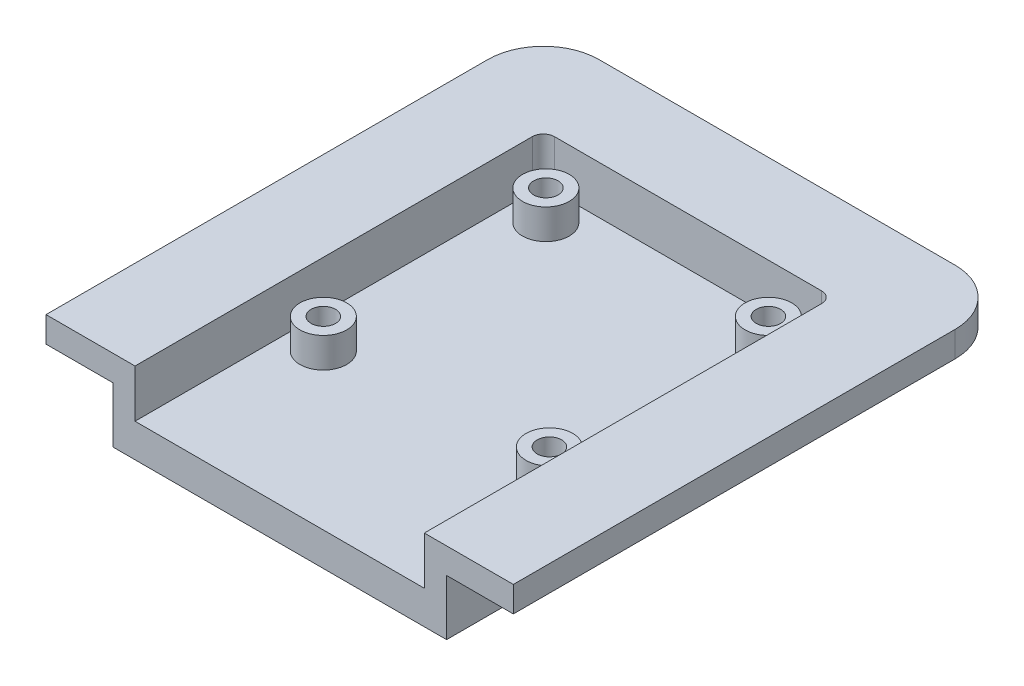
ISO-10303-21;
HEADER;
FILE_DESCRIPTION(('STEP AP214'),'2;1');
FILE_NAME('part.step','',(''),(''),'','','');
FILE_SCHEMA(('AUTOMOTIVE_DESIGN { 1 0 10303 214 1 1 1 1 }'));
ENDSEC;
DATA;
#1=APPLICATION_CONTEXT('core data for automotive mechanical design processes');
#2=APPLICATION_PROTOCOL_DEFINITION('international standard','automotive_design',2000,#1);
#3=PRODUCT_CONTEXT('',#1,'mechanical');
#4=PRODUCT('Part','Part','',(#3));
#5=PRODUCT_RELATED_PRODUCT_CATEGORY('part','',(#4));
#6=PRODUCT_DEFINITION_FORMATION('','',#4);
#7=PRODUCT_DEFINITION_CONTEXT('part definition',#1,'design');
#8=PRODUCT_DEFINITION('design','',#6,#7);
#9=PRODUCT_DEFINITION_SHAPE('','',#8);
#10=(LENGTH_UNIT() NAMED_UNIT(*) SI_UNIT(.MILLI.,.METRE.));
#11=(NAMED_UNIT(*) PLANE_ANGLE_UNIT() SI_UNIT($,.RADIAN.));
#12=(NAMED_UNIT(*) SI_UNIT($,.STERADIAN.) SOLID_ANGLE_UNIT());
#13=UNCERTAINTY_MEASURE_WITH_UNIT(LENGTH_MEASURE(1.E-05),#10,'distance_accuracy_value','');
#14=(GEOMETRIC_REPRESENTATION_CONTEXT(3) GLOBAL_UNCERTAINTY_ASSIGNED_CONTEXT((#13)) GLOBAL_UNIT_ASSIGNED_CONTEXT((#10,
#11,#12)) REPRESENTATION_CONTEXT('',''));
#15=CARTESIAN_POINT('',(0.,0.,0.));
#16=DIRECTION('',(0.,0.,1.));
#17=DIRECTION('',(1.,0.,0.));
#18=AXIS2_PLACEMENT_3D('',#15,#16,#17);
#19=CARTESIAN_POINT('',(-15.,3.,-19.35));
#20=DIRECTION('',(1.,0.,0.));
#21=DIRECTION('',(0.,0.,-1.));
#22=AXIS2_PLACEMENT_3D('',#19,#20,#21);
#23=PLANE('',#22);
#24=DIRECTION('',(0.,0.,-1.));
#25=VECTOR('',#24,1.);
#26=CARTESIAN_POINT('',(-15.,5.,19.35));
#27=LINE('',#26,#25);
#28=CARTESIAN_POINT('',(-15.,5.,19.35));
#29=VERTEX_POINT('',#28);
#30=CARTESIAN_POINT('',(-15.,5.,-19.35));
#31=VERTEX_POINT('',#30);
#32=EDGE_CURVE('E180',#29,#31,#27,.T.);
#33=ORIENTED_EDGE('',*,*,#32,.T.);
#34=DIRECTION('',(0.,-1.,0.));
#35=VECTOR('',#34,1.);
#36=CARTESIAN_POINT('',(-15.,3.,-19.35));
#37=LINE('',#36,#35);
#38=CARTESIAN_POINT('',(-15.,0.,-19.35));
#39=VERTEX_POINT('',#38);
#40=EDGE_CURVE('E260',#31,#39,#37,.T.);
#41=ORIENTED_EDGE('',*,*,#40,.T.);
#42=DIRECTION('',(0.,0.,1.));
#43=VECTOR('',#42,1.);
#44=CARTESIAN_POINT('',(-15.,0.,-19.35));
#45=LINE('',#44,#43);
#46=CARTESIAN_POINT('',(-15.,0.,19.35));
#47=VERTEX_POINT('',#46);
#48=EDGE_CURVE('E256',#39,#47,#45,.T.);
#49=ORIENTED_EDGE('',*,*,#48,.T.);
#50=DIRECTION('',(0.,-1.,0.));
#51=VECTOR('',#50,1.);
#52=CARTESIAN_POINT('',(-15.,3.,19.35));
#53=LINE('',#52,#51);
#54=EDGE_CURVE('E276',#29,#47,#53,.T.);
#55=ORIENTED_EDGE('',*,*,#54,.F.);
#56=EDGE_LOOP('',(#33,#41,#49,#55));
#57=FACE_BOUND('',#56,.T.);
#58=ADVANCED_FACE('F37',(#57),#23,.F.);
#59=CARTESIAN_POINT('',(15.,3.,-19.35));
#60=DIRECTION('',(-1.,0.,0.));
#61=DIRECTION('',(0.,0.,1.));
#62=AXIS2_PLACEMENT_3D('',#59,#60,#61);
#63=PLANE('',#62);
#64=DIRECTION('',(0.,0.,1.));
#65=VECTOR('',#64,1.);
#66=CARTESIAN_POINT('',(15.,5.,-19.35));
#67=LINE('',#66,#65);
#68=CARTESIAN_POINT('',(15.,5.,-19.35));
#69=VERTEX_POINT('',#68);
#70=CARTESIAN_POINT('',(15.,5.,19.35));
#71=VERTEX_POINT('',#70);
#72=EDGE_CURVE('E327',#69,#71,#67,.T.);
#73=ORIENTED_EDGE('',*,*,#72,.T.);
#74=DIRECTION('',(0.,-1.,0.));
#75=VECTOR('',#74,1.);
#76=CARTESIAN_POINT('',(15.,3.,19.35));
#77=LINE('',#76,#75);
#78=CARTESIAN_POINT('',(15.,0.,19.35));
#79=VERTEX_POINT('',#78);
#80=EDGE_CURVE('E274',#71,#79,#77,.T.);
#81=ORIENTED_EDGE('',*,*,#80,.T.);
#82=DIRECTION('',(0.,0.,-1.));
#83=VECTOR('',#82,1.);
#84=CARTESIAN_POINT('',(15.,0.,-19.35));
#85=LINE('',#84,#83);
#86=CARTESIAN_POINT('',(15.,0.,-19.35));
#87=VERTEX_POINT('',#86);
#88=EDGE_CURVE('E266',#79,#87,#85,.T.);
#89=ORIENTED_EDGE('',*,*,#88,.T.);
#90=DIRECTION('',(0.,-1.,0.));
#91=VECTOR('',#90,1.);
#92=CARTESIAN_POINT('',(15.,3.,-19.35));
#93=LINE('',#92,#91);
#94=EDGE_CURVE('E272',#69,#87,#93,.T.);
#95=ORIENTED_EDGE('',*,*,#94,.F.);
#96=EDGE_LOOP('',(#73,#81,#89,#95));
#97=FACE_BOUND('',#96,.T.);
#98=ADVANCED_FACE('F355',(#97),#63,.F.);
#99=CARTESIAN_POINT('',(-15.,3.,-19.35));
#100=DIRECTION('',(0.,0.,1.));
#101=DIRECTION('',(1.,0.,0.));
#102=AXIS2_PLACEMENT_3D('',#99,#100,#101);
#103=PLANE('',#102);
#104=DIRECTION('',(1.,0.,0.));
#105=VECTOR('',#104,1.);
#106=CARTESIAN_POINT('',(-15.,5.,-19.35));
#107=LINE('',#106,#105);
#108=EDGE_CURVE('E330',#31,#69,#107,.T.);
#109=ORIENTED_EDGE('',*,*,#108,.T.);
#110=ORIENTED_EDGE('',*,*,#94,.T.);
#111=DIRECTION('',(-1.,0.,0.));
#112=VECTOR('',#111,1.);
#113=CARTESIAN_POINT('',(-15.,0.,-19.35));
#114=LINE('',#113,#112);
#115=EDGE_CURVE('E261',#87,#39,#114,.T.);
#116=ORIENTED_EDGE('',*,*,#115,.T.);
#117=ORIENTED_EDGE('',*,*,#40,.F.);
#118=EDGE_LOOP('',(#109,#110,#116,#117));
#119=FACE_BOUND('',#118,.T.);
#120=ADVANCED_FACE('F340',(#119),#103,.F.);
#121=CARTESIAN_POINT('',(0.,3.,0.));
#122=DIRECTION('',(0.,1.,0.));
#123=DIRECTION('',(0.,0.,1.));
#124=AXIS2_PLACEMENT_3D('',#121,#122,#123);
#125=PLANE('',#124);
#126=CARTESIAN_POINT('',(10.3175282746201,3.,5.42687400973538));
#127=DIRECTION('',(0.,1.,0.));
#128=DIRECTION('',(0.,0.,1.));
#129=AXIS2_PLACEMENT_3D('',#126,#127,#128);
#130=CIRCLE('',#129,2.1);
#131=CARTESIAN_POINT('',(10.3175282746201,3.,7.52687400973538));
#132=VERTEX_POINT('',#131);
#133=EDGE_CURVE('E201',#132,#132,#130,.T.);
#134=ORIENTED_EDGE('',*,*,#133,.F.);
#135=EDGE_LOOP('',(#134));
#136=FACE_BOUND('',#135,.T.);
#137=CARTESIAN_POINT('',(-10.,3.,-14.5731259902646));
#138=DIRECTION('',(0.,1.,0.));
#139=DIRECTION('',(0.,0.,1.));
#140=AXIS2_PLACEMENT_3D('',#137,#138,#139);
#141=CIRCLE('',#140,2.1);
#142=CARTESIAN_POINT('',(-10.,3.,-12.4731259902646));
#143=VERTEX_POINT('',#142);
#144=EDGE_CURVE('E219',#143,#143,#141,.T.);
#145=ORIENTED_EDGE('',*,*,#144,.F.);
#146=EDGE_LOOP('',(#145));
#147=FACE_BOUND('',#146,.T.);
#148=DIRECTION('',(0.,0.,1.));
#149=VECTOR('',#148,1.);
#150=CARTESIAN_POINT('',(13.,3.,19.35));
#151=LINE('',#150,#149);
#152=CARTESIAN_POINT('',(13.,3.,-16.35));
#153=VERTEX_POINT('',#152);
#154=CARTESIAN_POINT('',(13.,3.,19.35));
#155=VERTEX_POINT('',#154);
#156=EDGE_CURVE('E248',#153,#155,#151,.T.);
#157=ORIENTED_EDGE('',*,*,#156,.F.);
#158=CARTESIAN_POINT('',(12.,3.,-16.35));
#159=DIRECTION('',(0.,1.,0.));
#160=DIRECTION('',(0.,0.,1.));
#161=AXIS2_PLACEMENT_3D('',#158,#159,#160);
#162=CIRCLE('',#161,1.);
#163=CARTESIAN_POINT('',(12.,3.,-17.35));
#164=VERTEX_POINT('',#163);
#165=EDGE_CURVE('E283',#153,#164,#162,.T.);
#166=ORIENTED_EDGE('',*,*,#165,.T.);
#167=DIRECTION('',(1.,0.,0.));
#168=VECTOR('',#167,1.);
#169=CARTESIAN_POINT('',(13.,3.,-17.35));
#170=LINE('',#169,#168);
#171=CARTESIAN_POINT('',(-12.,3.,-17.35));
#172=VERTEX_POINT('',#171);
#173=EDGE_CURVE('E237',#172,#164,#170,.T.);
#174=ORIENTED_EDGE('',*,*,#173,.F.);
#175=CARTESIAN_POINT('',(-12.,3.,-16.35));
#176=DIRECTION('',(0.,1.,0.));
#177=DIRECTION('',(0.,0.,1.));
#178=AXIS2_PLACEMENT_3D('',#175,#176,#177);
#179=CIRCLE('',#178,1.);
#180=CARTESIAN_POINT('',(-13.,3.,-16.35));
#181=VERTEX_POINT('',#180);
#182=EDGE_CURVE('E281',#172,#181,#179,.T.);
#183=ORIENTED_EDGE('',*,*,#182,.T.);
#184=DIRECTION('',(0.,0.,-1.));
#185=VECTOR('',#184,1.);
#186=CARTESIAN_POINT('',(-13.,3.,-17.35));
#187=LINE('',#186,#185);
#188=CARTESIAN_POINT('',(-13.,3.,19.35));
#189=VERTEX_POINT('',#188);
#190=EDGE_CURVE('E242',#189,#181,#187,.T.);
#191=ORIENTED_EDGE('',*,*,#190,.F.);
#192=DIRECTION('',(1.,0.,0.));
#193=VECTOR('',#192,1.);
#194=CARTESIAN_POINT('',(-15.,3.,19.35));
#195=LINE('',#194,#193);
#196=EDGE_CURVE('E257',#189,#155,#195,.T.);
#197=ORIENTED_EDGE('',*,*,#196,.T.);
#198=EDGE_LOOP('',(#157,#166,#174,#183,#191,#197));
#199=FACE_BOUND('',#198,.T.);
#200=CARTESIAN_POINT('',(10.,3.,-14.5731259902646));
#201=DIRECTION('',(0.,1.,0.));
#202=DIRECTION('',(0.,0.,1.));
#203=AXIS2_PLACEMENT_3D('',#200,#201,#202);
#204=CIRCLE('',#203,2.1);
#205=CARTESIAN_POINT('',(10.,3.,-12.4731259902646));
#206=VERTEX_POINT('',#205);
#207=EDGE_CURVE('E210',#206,#206,#204,.T.);
#208=ORIENTED_EDGE('',*,*,#207,.F.);
#209=EDGE_LOOP('',(#208));
#210=FACE_BOUND('',#209,.T.);
#211=CARTESIAN_POINT('',(-10.,3.,5.42687400973538));
#212=DIRECTION('',(0.,1.,0.));
#213=DIRECTION('',(0.,0.,1.));
#214=AXIS2_PLACEMENT_3D('',#211,#212,#213);
#215=CIRCLE('',#214,2.1);
#216=CARTESIAN_POINT('',(-10.,3.,7.52687400973538));
#217=VERTEX_POINT('',#216);
#218=EDGE_CURVE('E192',#217,#217,#215,.T.);
#219=ORIENTED_EDGE('',*,*,#218,.F.);
#220=EDGE_LOOP('',(#219));
#221=FACE_BOUND('',#220,.T.);
#222=ADVANCED_FACE('F397',(#136,#147,#199,#210,#221),#125,.T.);
#223=CARTESIAN_POINT('',(-15.,3.,19.35));
#224=DIRECTION('',(0.,0.,-1.));
#225=DIRECTION('',(-1.,0.,0.));
#226=AXIS2_PLACEMENT_3D('',#223,#224,#225);
#227=PLANE('',#226);
#228=DIRECTION('',(1.,0.,0.));
#229=VECTOR('',#228,1.);
#230=CARTESIAN_POINT('',(-15.,0.,19.35));
#231=LINE('',#230,#229);
#232=EDGE_CURVE('E264',#47,#79,#231,.T.);
#233=ORIENTED_EDGE('',*,*,#232,.T.);
#234=ORIENTED_EDGE('',*,*,#80,.F.);
#235=DIRECTION('',(1.,0.,0.));
#236=VECTOR('',#235,1.);
#237=CARTESIAN_POINT('',(15.,5.,19.35));
#238=LINE('',#237,#236);
#239=CARTESIAN_POINT('',(21.,5.,19.35));
#240=VERTEX_POINT('',#239);
#241=EDGE_CURVE('E188',#71,#240,#238,.T.);
#242=ORIENTED_EDGE('',*,*,#241,.T.);
#243=DIRECTION('',(0.,-1.,0.));
#244=VECTOR('',#243,1.);
#245=CARTESIAN_POINT('',(21.,68.6358785703768,19.35));
#246=LINE('',#245,#244);
#247=CARTESIAN_POINT('',(21.,7.3,19.35));
#248=VERTEX_POINT('',#247);
#249=EDGE_CURVE('E185',#248,#240,#246,.T.);
#250=ORIENTED_EDGE('',*,*,#249,.F.);
#251=DIRECTION('',(1.,0.,0.));
#252=VECTOR('',#251,1.);
#253=CARTESIAN_POINT('',(15.,7.3,19.35));
#254=LINE('',#253,#252);
#255=CARTESIAN_POINT('',(13.,7.3,19.35));
#256=VERTEX_POINT('',#255);
#257=EDGE_CURVE('E173',#256,#248,#254,.T.);
#258=ORIENTED_EDGE('',*,*,#257,.F.);
#259=DIRECTION('',(0.,-1.,0.));
#260=VECTOR('',#259,1.);
#261=CARTESIAN_POINT('',(13.,7.3,19.35));
#262=LINE('',#261,#260);
#263=EDGE_CURVE('E253',#256,#155,#262,.T.);
#264=ORIENTED_EDGE('',*,*,#263,.T.);
#265=ORIENTED_EDGE('',*,*,#196,.F.);
#266=DIRECTION('',(0.,-1.,0.));
#267=VECTOR('',#266,1.);
#268=CARTESIAN_POINT('',(-13.,7.3,19.35));
#269=LINE('',#268,#267);
#270=CARTESIAN_POINT('',(-13.,7.3,19.35));
#271=VERTEX_POINT('',#270);
#272=EDGE_CURVE('E170',#271,#189,#269,.T.);
#273=ORIENTED_EDGE('',*,*,#272,.F.);
#274=DIRECTION('',(1.,0.,0.));
#275=VECTOR('',#274,1.);
#276=CARTESIAN_POINT('',(-13.,7.3,19.35));
#277=LINE('',#276,#275);
#278=CARTESIAN_POINT('',(-21.,7.3,19.35));
#279=VERTEX_POINT('',#278);
#280=EDGE_CURVE('E154',#279,#271,#277,.T.);
#281=ORIENTED_EDGE('',*,*,#280,.F.);
#282=DIRECTION('',(0.,-1.,0.));
#283=VECTOR('',#282,1.);
#284=CARTESIAN_POINT('',(-21.,68.6358785703768,19.35));
#285=LINE('',#284,#283);
#286=CARTESIAN_POINT('',(-21.,5.,19.35));
#287=VERTEX_POINT('',#286);
#288=EDGE_CURVE('E166',#279,#287,#285,.T.);
#289=ORIENTED_EDGE('',*,*,#288,.T.);
#290=DIRECTION('',(1.,0.,0.));
#291=VECTOR('',#290,1.);
#292=CARTESIAN_POINT('',(-21.,5.,19.35));
#293=LINE('',#292,#291);
#294=EDGE_CURVE('E178',#287,#29,#293,.T.);
#295=ORIENTED_EDGE('',*,*,#294,.T.);
#296=ORIENTED_EDGE('',*,*,#54,.T.);
#297=EDGE_LOOP('',(#233,#234,#242,#250,#258,#264,#265,#273,#281,#289,#295,#296));
#298=FACE_BOUND('',#297,.T.);
#299=ADVANCED_FACE('F165',(#298),#227,.F.);
#300=CARTESIAN_POINT('',(0.,0.,0.));
#301=DIRECTION('',(0.,1.,0.));
#302=DIRECTION('',(0.,0.,1.));
#303=AXIS2_PLACEMENT_3D('',#300,#301,#302);
#304=PLANE('',#303);
#305=CARTESIAN_POINT('',(10.,0.,-14.5731259902646));
#306=DIRECTION('',(0.,1.,0.));
#307=DIRECTION('',(0.,0.,1.));
#308=AXIS2_PLACEMENT_3D('',#305,#306,#307);
#309=CIRCLE('',#308,1.1);
#310=CARTESIAN_POINT('',(10.,0.,-13.4731259902646));
#311=VERTEX_POINT('',#310);
#312=EDGE_CURVE('E226',#311,#311,#309,.T.);
#313=ORIENTED_EDGE('',*,*,#312,.T.);
#314=EDGE_LOOP('',(#313));
#315=FACE_BOUND('',#314,.T.);
#316=CARTESIAN_POINT('',(-10.,0.,5.42687400973538));
#317=DIRECTION('',(0.,1.,0.));
#318=DIRECTION('',(0.,0.,1.));
#319=AXIS2_PLACEMENT_3D('',#316,#317,#318);
#320=CIRCLE('',#319,1.1);
#321=CARTESIAN_POINT('',(-10.,0.,6.52687400973538));
#322=VERTEX_POINT('',#321);
#323=EDGE_CURVE('E230',#322,#322,#320,.T.);
#324=ORIENTED_EDGE('',*,*,#323,.T.);
#325=EDGE_LOOP('',(#324));
#326=FACE_BOUND('',#325,.T.);
#327=CARTESIAN_POINT('',(10.3175282746201,0.,5.42687400973538));
#328=DIRECTION('',(0.,1.,0.));
#329=DIRECTION('',(0.,0.,1.));
#330=AXIS2_PLACEMENT_3D('',#327,#328,#329);
#331=CIRCLE('',#330,1.1);
#332=CARTESIAN_POINT('',(10.3175282746201,0.,6.52687400973538));
#333=VERTEX_POINT('',#332);
#334=EDGE_CURVE('E223',#333,#333,#331,.T.);
#335=ORIENTED_EDGE('',*,*,#334,.T.);
#336=EDGE_LOOP('',(#335));
#337=FACE_BOUND('',#336,.T.);
#338=CARTESIAN_POINT('',(-10.,0.,-14.5731259902646));
#339=DIRECTION('',(0.,1.,0.));
#340=DIRECTION('',(0.,0.,1.));
#341=AXIS2_PLACEMENT_3D('',#338,#339,#340);
#342=CIRCLE('',#341,1.1);
#343=CARTESIAN_POINT('',(-10.,0.,-13.4731259902646));
#344=VERTEX_POINT('',#343);
#345=EDGE_CURVE('E229',#344,#344,#342,.T.);
#346=ORIENTED_EDGE('',*,*,#345,.T.);
#347=EDGE_LOOP('',(#346));
#348=FACE_BOUND('',#347,.T.);
#349=ORIENTED_EDGE('',*,*,#48,.F.);
#350=ORIENTED_EDGE('',*,*,#115,.F.);
#351=ORIENTED_EDGE('',*,*,#88,.F.);
#352=ORIENTED_EDGE('',*,*,#232,.F.);
#353=EDGE_LOOP('',(#349,#350,#351,#352));
#354=FACE_BOUND('',#353,.T.);
#355=ADVANCED_FACE('F347',(#315,#326,#337,#348,#354),#304,.F.);
#356=CARTESIAN_POINT('',(13.,7.3,-17.35));
#357=DIRECTION('',(0.,0.,-1.));
#358=DIRECTION('',(-1.,0.,0.));
#359=AXIS2_PLACEMENT_3D('',#356,#357,#358);
#360=PLANE('',#359);
#361=ORIENTED_EDGE('',*,*,#173,.T.);
#362=DIRECTION('',(0.,-1.,0.));
#363=VECTOR('',#362,1.);
#364=CARTESIAN_POINT('',(12.,7.3,-17.35));
#365=LINE('',#364,#363);
#366=CARTESIAN_POINT('',(12.,7.3,-17.35));
#367=VERTEX_POINT('',#366);
#368=EDGE_CURVE('E288',#164,#367,#365,.F.);
#369=ORIENTED_EDGE('',*,*,#368,.T.);
#370=DIRECTION('',(1.,0.,0.));
#371=VECTOR('',#370,1.);
#372=CARTESIAN_POINT('',(13.,7.3,-17.35));
#373=LINE('',#372,#371);
#374=CARTESIAN_POINT('',(-12.,7.3,-17.35));
#375=VERTEX_POINT('',#374);
#376=EDGE_CURVE('E238',#375,#367,#373,.T.);
#377=ORIENTED_EDGE('',*,*,#376,.F.);
#378=DIRECTION('',(0.,-1.,0.));
#379=VECTOR('',#378,1.);
#380=CARTESIAN_POINT('',(-12.,3.,-17.35));
#381=LINE('',#380,#379);
#382=EDGE_CURVE('E285',#375,#172,#381,.T.);
#383=ORIENTED_EDGE('',*,*,#382,.T.);
#384=EDGE_LOOP('',(#361,#369,#377,#383));
#385=FACE_BOUND('',#384,.T.);
#386=ADVANCED_FACE('F384',(#385),#360,.F.);
#387=CARTESIAN_POINT('',(13.,7.3,19.35));
#388=DIRECTION('',(1.,0.,0.));
#389=DIRECTION('',(0.,0.,-1.));
#390=AXIS2_PLACEMENT_3D('',#387,#388,#389);
#391=PLANE('',#390);
#392=DIRECTION('',(0.,0.,1.));
#393=VECTOR('',#392,1.);
#394=CARTESIAN_POINT('',(13.,7.3,19.35));
#395=LINE('',#394,#393);
#396=CARTESIAN_POINT('',(13.,7.3,-16.35));
#397=VERTEX_POINT('',#396);
#398=EDGE_CURVE('E241',#397,#256,#395,.T.);
#399=ORIENTED_EDGE('',*,*,#398,.F.);
#400=DIRECTION('',(0.,-1.,0.));
#401=VECTOR('',#400,1.);
#402=CARTESIAN_POINT('',(13.,3.,-16.35));
#403=LINE('',#402,#401);
#404=EDGE_CURVE('E278',#397,#153,#403,.T.);
#405=ORIENTED_EDGE('',*,*,#404,.T.);
#406=ORIENTED_EDGE('',*,*,#156,.T.);
#407=ORIENTED_EDGE('',*,*,#263,.F.);
#408=EDGE_LOOP('',(#399,#405,#406,#407));
#409=FACE_BOUND('',#408,.T.);
#410=ADVANCED_FACE('F391',(#409),#391,.F.);
#411=CARTESIAN_POINT('',(-13.,7.3,-17.35));
#412=DIRECTION('',(-1.,0.,0.));
#413=DIRECTION('',(0.,0.,1.));
#414=AXIS2_PLACEMENT_3D('',#411,#412,#413);
#415=PLANE('',#414);
#416=ORIENTED_EDGE('',*,*,#190,.T.);
#417=DIRECTION('',(0.,-1.,0.));
#418=VECTOR('',#417,1.);
#419=CARTESIAN_POINT('',(-13.,7.3,-16.35));
#420=LINE('',#419,#418);
#421=CARTESIAN_POINT('',(-13.,7.3,-16.35));
#422=VERTEX_POINT('',#421);
#423=EDGE_CURVE('E290',#181,#422,#420,.F.);
#424=ORIENTED_EDGE('',*,*,#423,.T.);
#425=DIRECTION('',(0.,0.,-1.));
#426=VECTOR('',#425,1.);
#427=CARTESIAN_POINT('',(-13.,7.3,-17.35));
#428=LINE('',#427,#426);
#429=EDGE_CURVE('E172',#271,#422,#428,.T.);
#430=ORIENTED_EDGE('',*,*,#429,.F.);
#431=ORIENTED_EDGE('',*,*,#272,.T.);
#432=EDGE_LOOP('',(#416,#424,#430,#431));
#433=FACE_BOUND('',#432,.T.);
#434=ADVANCED_FACE('F396',(#433),#415,.F.);
#435=CARTESIAN_POINT('',(0.,7.3,0.));
#436=DIRECTION('',(0.,1.,0.));
#437=DIRECTION('',(0.,0.,1.));
#438=AXIS2_PLACEMENT_3D('',#435,#436,#437);
#439=PLANE('',#438);
#440=DIRECTION('',(0.,0.,-1.));
#441=VECTOR('',#440,1.);
#442=CARTESIAN_POINT('',(21.,7.3,-25.35));
#443=LINE('',#442,#441);
#444=CARTESIAN_POINT('',(21.,7.3,-20.35));
#445=VERTEX_POINT('',#444);
#446=EDGE_CURVE('E159',#248,#445,#443,.T.);
#447=ORIENTED_EDGE('',*,*,#446,.T.);
#448=CARTESIAN_POINT('',(16.,7.3,-20.35));
#449=DIRECTION('',(0.,1.,0.));
#450=DIRECTION('',(0.,0.,1.));
#451=AXIS2_PLACEMENT_3D('',#448,#449,#450);
#452=CIRCLE('',#451,5.);
#453=CARTESIAN_POINT('',(16.,7.3,-25.35));
#454=VERTEX_POINT('',#453);
#455=EDGE_CURVE('E45',#445,#454,#452,.T.);
#456=ORIENTED_EDGE('',*,*,#455,.T.);
#457=DIRECTION('',(-1.,0.,0.));
#458=VECTOR('',#457,1.);
#459=CARTESIAN_POINT('',(-21.,7.3,-25.35));
#460=LINE('',#459,#458);
#461=CARTESIAN_POINT('',(-16.,7.3,-25.35));
#462=VERTEX_POINT('',#461);
#463=EDGE_CURVE('E160',#454,#462,#460,.T.);
#464=ORIENTED_EDGE('',*,*,#463,.T.);
#465=CARTESIAN_POINT('',(-16.,7.3,-20.35));
#466=DIRECTION('',(0.,1.,0.));
#467=DIRECTION('',(0.,0.,1.));
#468=AXIS2_PLACEMENT_3D('',#465,#466,#467);
#469=CIRCLE('',#468,5.);
#470=CARTESIAN_POINT('',(-21.,7.3,-20.35));
#471=VERTEX_POINT('',#470);
#472=EDGE_CURVE('E52',#462,#471,#469,.T.);
#473=ORIENTED_EDGE('',*,*,#472,.T.);
#474=DIRECTION('',(0.,0.,1.));
#475=VECTOR('',#474,1.);
#476=CARTESIAN_POINT('',(-21.,7.3,-25.35));
#477=LINE('',#476,#475);
#478=EDGE_CURVE('E150',#471,#279,#477,.T.);
#479=ORIENTED_EDGE('',*,*,#478,.T.);
#480=ORIENTED_EDGE('',*,*,#280,.T.);
#481=ORIENTED_EDGE('',*,*,#429,.T.);
#482=CARTESIAN_POINT('',(-12.,7.3,-16.35));
#483=DIRECTION('',(0.,1.,0.));
#484=DIRECTION('',(0.,0.,1.));
#485=AXIS2_PLACEMENT_3D('',#482,#483,#484);
#486=CIRCLE('',#485,1.);
#487=EDGE_CURVE('E294',#422,#375,#486,.F.);
#488=ORIENTED_EDGE('',*,*,#487,.T.);
#489=ORIENTED_EDGE('',*,*,#376,.T.);
#490=CARTESIAN_POINT('',(12.,7.3,-16.35));
#491=DIRECTION('',(0.,1.,0.));
#492=DIRECTION('',(0.,0.,1.));
#493=AXIS2_PLACEMENT_3D('',#490,#491,#492);
#494=CIRCLE('',#493,1.);
#495=EDGE_CURVE('E292',#367,#397,#494,.F.);
#496=ORIENTED_EDGE('',*,*,#495,.T.);
#497=ORIENTED_EDGE('',*,*,#398,.T.);
#498=ORIENTED_EDGE('',*,*,#257,.T.);
#499=EDGE_LOOP('',(#447,#456,#464,#473,#479,#480,#481,#488,#489,#496,#497,#498));
#500=FACE_BOUND('',#499,.T.);
#501=ADVANCED_FACE('F152',(#500),#439,.T.);
#502=CARTESIAN_POINT('',(12.,7.3,-16.35));
#503=DIRECTION('',(0.,1.,0.));
#504=DIRECTION('',(0.,0.,1.));
#505=AXIS2_PLACEMENT_3D('',#502,#503,#504);
#506=CYLINDRICAL_SURFACE('',#505,1.);
#507=ORIENTED_EDGE('',*,*,#495,.F.);
#508=ORIENTED_EDGE('',*,*,#368,.F.);
#509=ORIENTED_EDGE('',*,*,#165,.F.);
#510=ORIENTED_EDGE('',*,*,#404,.F.);
#511=EDGE_LOOP('',(#507,#508,#509,#510));
#512=FACE_BOUND('',#511,.T.);
#513=ADVANCED_FACE('F364',(#512),#506,.F.);
#514=CARTESIAN_POINT('',(-12.,7.3,-16.35));
#515=DIRECTION('',(0.,1.,0.));
#516=DIRECTION('',(0.,0.,1.));
#517=AXIS2_PLACEMENT_3D('',#514,#515,#516);
#518=CYLINDRICAL_SURFACE('',#517,1.);
#519=ORIENTED_EDGE('',*,*,#487,.F.);
#520=ORIENTED_EDGE('',*,*,#423,.F.);
#521=ORIENTED_EDGE('',*,*,#182,.F.);
#522=ORIENTED_EDGE('',*,*,#382,.F.);
#523=EDGE_LOOP('',(#519,#520,#521,#522));
#524=FACE_BOUND('',#523,.T.);
#525=ADVANCED_FACE('F367',(#524),#518,.F.);
#526=CARTESIAN_POINT('',(-10.,0.,-14.5731259902646));
#527=DIRECTION('',(0.,1.,0.));
#528=DIRECTION('',(0.,0.,1.));
#529=AXIS2_PLACEMENT_3D('',#526,#527,#528);
#530=CYLINDRICAL_SURFACE('',#529,1.1);
#531=ORIENTED_EDGE('',*,*,#345,.F.);
#532=EDGE_LOOP('',(#531));
#533=FACE_BOUND('',#532,.T.);
#534=CARTESIAN_POINT('',(-10.,5.7,-14.5731259902646));
#535=DIRECTION('',(0.,1.,0.));
#536=DIRECTION('',(0.,0.,1.));
#537=AXIS2_PLACEMENT_3D('',#534,#535,#536);
#538=CIRCLE('',#537,1.1);
#539=CARTESIAN_POINT('',(-10.,5.7,-13.4731259902646));
#540=VERTEX_POINT('',#539);
#541=EDGE_CURVE('E214',#540,#540,#538,.T.);
#542=ORIENTED_EDGE('',*,*,#541,.T.);
#543=EDGE_LOOP('',(#542));
#544=FACE_BOUND('',#543,.T.);
#545=ADVANCED_FACE('F370',(#533,#544),#530,.F.);
#546=CARTESIAN_POINT('',(10.3175282746201,0.,5.42687400973538));
#547=DIRECTION('',(0.,1.,0.));
#548=DIRECTION('',(0.,0.,1.));
#549=AXIS2_PLACEMENT_3D('',#546,#547,#548);
#550=CYLINDRICAL_SURFACE('',#549,1.1);
#551=ORIENTED_EDGE('',*,*,#334,.F.);
#552=EDGE_LOOP('',(#551));
#553=FACE_BOUND('',#552,.T.);
#554=CARTESIAN_POINT('',(10.3175282746201,5.7,5.42687400973538));
#555=DIRECTION('',(0.,1.,0.));
#556=DIRECTION('',(0.,0.,1.));
#557=AXIS2_PLACEMENT_3D('',#554,#555,#556);
#558=CIRCLE('',#557,1.1);
#559=CARTESIAN_POINT('',(10.3175282746201,5.7,6.52687400973538));
#560=VERTEX_POINT('',#559);
#561=EDGE_CURVE('E196',#560,#560,#558,.T.);
#562=ORIENTED_EDGE('',*,*,#561,.T.);
#563=EDGE_LOOP('',(#562));
#564=FACE_BOUND('',#563,.T.);
#565=ADVANCED_FACE('F375',(#553,#564),#550,.F.);
#566=CARTESIAN_POINT('',(-10.,0.,5.42687400973538));
#567=DIRECTION('',(0.,1.,0.));
#568=DIRECTION('',(0.,0.,1.));
#569=AXIS2_PLACEMENT_3D('',#566,#567,#568);
#570=CYLINDRICAL_SURFACE('',#569,1.1);
#571=ORIENTED_EDGE('',*,*,#323,.F.);
#572=EDGE_LOOP('',(#571));
#573=FACE_BOUND('',#572,.T.);
#574=CARTESIAN_POINT('',(-10.,5.7,5.42687400973538));
#575=DIRECTION('',(0.,1.,0.));
#576=DIRECTION('',(0.,0.,1.));
#577=AXIS2_PLACEMENT_3D('',#574,#575,#576);
#578=CIRCLE('',#577,1.1);
#579=CARTESIAN_POINT('',(-10.,5.7,6.52687400973538));
#580=VERTEX_POINT('',#579);
#581=EDGE_CURVE('E189',#580,#580,#578,.T.);
#582=ORIENTED_EDGE('',*,*,#581,.T.);
#583=EDGE_LOOP('',(#582));
#584=FACE_BOUND('',#583,.T.);
#585=ADVANCED_FACE('F447',(#573,#584),#570,.F.);
#586=CARTESIAN_POINT('',(10.,0.,-14.5731259902646));
#587=DIRECTION('',(0.,1.,0.));
#588=DIRECTION('',(0.,0.,1.));
#589=AXIS2_PLACEMENT_3D('',#586,#587,#588);
#590=CYLINDRICAL_SURFACE('',#589,1.1);
#591=ORIENTED_EDGE('',*,*,#312,.F.);
#592=EDGE_LOOP('',(#591));
#593=FACE_BOUND('',#592,.T.);
#594=CARTESIAN_POINT('',(10.,5.7,-14.5731259902646));
#595=DIRECTION('',(0.,1.,0.));
#596=DIRECTION('',(0.,0.,1.));
#597=AXIS2_PLACEMENT_3D('',#594,#595,#596);
#598=CIRCLE('',#597,1.1);
#599=CARTESIAN_POINT('',(10.,5.7,-13.4731259902646));
#600=VERTEX_POINT('',#599);
#601=EDGE_CURVE('E205',#600,#600,#598,.T.);
#602=ORIENTED_EDGE('',*,*,#601,.T.);
#603=EDGE_LOOP('',(#602));
#604=FACE_BOUND('',#603,.T.);
#605=ADVANCED_FACE('F440',(#593,#604),#590,.F.);
#606=CARTESIAN_POINT('',(-10.,5.7,-14.5731259902646));
#607=DIRECTION('',(0.,1.,0.));
#608=DIRECTION('',(0.,0.,1.));
#609=AXIS2_PLACEMENT_3D('',#606,#607,#608);
#610=PLANE('',#609);
#611=CARTESIAN_POINT('',(-10.,5.7,-14.5731259902646));
#612=DIRECTION('',(0.,1.,0.));
#613=DIRECTION('',(0.,0.,1.));
#614=AXIS2_PLACEMENT_3D('',#611,#612,#613);
#615=CIRCLE('',#614,2.1);
#616=CARTESIAN_POINT('',(-10.,5.7,-12.4731259902646));
#617=VERTEX_POINT('',#616);
#618=EDGE_CURVE('E220',#617,#617,#615,.T.);
#619=ORIENTED_EDGE('',*,*,#618,.T.);
#620=EDGE_LOOP('',(#619));
#621=FACE_BOUND('',#620,.T.);
#622=ORIENTED_EDGE('',*,*,#541,.F.);
#623=EDGE_LOOP('',(#622));
#624=FACE_BOUND('',#623,.T.);
#625=ADVANCED_FACE('F437',(#621,#624),#610,.T.);
#626=CARTESIAN_POINT('',(-10.,5.7,-14.5731259902646));
#627=DIRECTION('',(0.,-1.,0.));
#628=DIRECTION('',(0.,0.,-1.));
#629=AXIS2_PLACEMENT_3D('',#626,#627,#628);
#630=CYLINDRICAL_SURFACE('',#629,2.1);
#631=ORIENTED_EDGE('',*,*,#618,.F.);
#632=EDGE_LOOP('',(#631));
#633=FACE_BOUND('',#632,.T.);
#634=ORIENTED_EDGE('',*,*,#144,.T.);
#635=EDGE_LOOP('',(#634));
#636=FACE_BOUND('',#635,.T.);
#637=ADVANCED_FACE('F432',(#633,#636),#630,.T.);
#638=CARTESIAN_POINT('',(10.,5.7,-14.5731259902646));
#639=DIRECTION('',(0.,1.,0.));
#640=DIRECTION('',(0.,0.,1.));
#641=AXIS2_PLACEMENT_3D('',#638,#639,#640);
#642=PLANE('',#641);
#643=CARTESIAN_POINT('',(10.,5.7,-14.5731259902646));
#644=DIRECTION('',(0.,1.,0.));
#645=DIRECTION('',(0.,0.,1.));
#646=AXIS2_PLACEMENT_3D('',#643,#644,#645);
#647=CIRCLE('',#646,2.1);
#648=CARTESIAN_POINT('',(10.,5.7,-12.4731259902646));
#649=VERTEX_POINT('',#648);
#650=EDGE_CURVE('E211',#649,#649,#647,.T.);
#651=ORIENTED_EDGE('',*,*,#650,.T.);
#652=EDGE_LOOP('',(#651));
#653=FACE_BOUND('',#652,.T.);
#654=ORIENTED_EDGE('',*,*,#601,.F.);
#655=EDGE_LOOP('',(#654));
#656=FACE_BOUND('',#655,.T.);
#657=ADVANCED_FACE('F429',(#653,#656),#642,.T.);
#658=CARTESIAN_POINT('',(10.,5.7,-14.5731259902646));
#659=DIRECTION('',(0.,-1.,0.));
#660=DIRECTION('',(0.,0.,-1.));
#661=AXIS2_PLACEMENT_3D('',#658,#659,#660);
#662=CYLINDRICAL_SURFACE('',#661,2.1);
#663=ORIENTED_EDGE('',*,*,#650,.F.);
#664=EDGE_LOOP('',(#663));
#665=FACE_BOUND('',#664,.T.);
#666=ORIENTED_EDGE('',*,*,#207,.T.);
#667=EDGE_LOOP('',(#666));
#668=FACE_BOUND('',#667,.T.);
#669=ADVANCED_FACE('F424',(#665,#668),#662,.T.);
#670=CARTESIAN_POINT('',(10.3175282746201,5.7,5.42687400973538));
#671=DIRECTION('',(0.,1.,0.));
#672=DIRECTION('',(0.,0.,1.));
#673=AXIS2_PLACEMENT_3D('',#670,#671,#672);
#674=PLANE('',#673);
#675=CARTESIAN_POINT('',(10.3175282746201,5.7,5.42687400973538));
#676=DIRECTION('',(0.,1.,0.));
#677=DIRECTION('',(0.,0.,1.));
#678=AXIS2_PLACEMENT_3D('',#675,#676,#677);
#679=CIRCLE('',#678,2.1);
#680=CARTESIAN_POINT('',(10.3175282746201,5.7,7.52687400973538));
#681=VERTEX_POINT('',#680);
#682=EDGE_CURVE('E202',#681,#681,#679,.T.);
#683=ORIENTED_EDGE('',*,*,#682,.T.);
#684=EDGE_LOOP('',(#683));
#685=FACE_BOUND('',#684,.T.);
#686=ORIENTED_EDGE('',*,*,#561,.F.);
#687=EDGE_LOOP('',(#686));
#688=FACE_BOUND('',#687,.T.);
#689=ADVANCED_FACE('F421',(#685,#688),#674,.T.);
#690=CARTESIAN_POINT('',(10.3175282746201,5.7,5.42687400973538));
#691=DIRECTION('',(0.,-1.,0.));
#692=DIRECTION('',(0.,0.,-1.));
#693=AXIS2_PLACEMENT_3D('',#690,#691,#692);
#694=CYLINDRICAL_SURFACE('',#693,2.1);
#695=ORIENTED_EDGE('',*,*,#682,.F.);
#696=EDGE_LOOP('',(#695));
#697=FACE_BOUND('',#696,.T.);
#698=ORIENTED_EDGE('',*,*,#133,.T.);
#699=EDGE_LOOP('',(#698));
#700=FACE_BOUND('',#699,.T.);
#701=ADVANCED_FACE('F416',(#697,#700),#694,.T.);
#702=CARTESIAN_POINT('',(-10.,5.7,5.42687400973538));
#703=DIRECTION('',(0.,1.,0.));
#704=DIRECTION('',(0.,0.,1.));
#705=AXIS2_PLACEMENT_3D('',#702,#703,#704);
#706=PLANE('',#705);
#707=CARTESIAN_POINT('',(-10.,5.7,5.42687400973538));
#708=DIRECTION('',(0.,1.,0.));
#709=DIRECTION('',(0.,0.,1.));
#710=AXIS2_PLACEMENT_3D('',#707,#708,#709);
#711=CIRCLE('',#710,2.1);
#712=CARTESIAN_POINT('',(-10.,5.7,7.52687400973538));
#713=VERTEX_POINT('',#712);
#714=EDGE_CURVE('E193',#713,#713,#711,.T.);
#715=ORIENTED_EDGE('',*,*,#714,.T.);
#716=EDGE_LOOP('',(#715));
#717=FACE_BOUND('',#716,.T.);
#718=ORIENTED_EDGE('',*,*,#581,.F.);
#719=EDGE_LOOP('',(#718));
#720=FACE_BOUND('',#719,.T.);
#721=ADVANCED_FACE('F408',(#717,#720),#706,.T.);
#722=CARTESIAN_POINT('',(-10.,5.7,5.42687400973538));
#723=DIRECTION('',(0.,-1.,0.));
#724=DIRECTION('',(0.,0.,-1.));
#725=AXIS2_PLACEMENT_3D('',#722,#723,#724);
#726=CYLINDRICAL_SURFACE('',#725,2.1);
#727=ORIENTED_EDGE('',*,*,#714,.F.);
#728=EDGE_LOOP('',(#727));
#729=FACE_BOUND('',#728,.T.);
#730=ORIENTED_EDGE('',*,*,#218,.T.);
#731=EDGE_LOOP('',(#730));
#732=FACE_BOUND('',#731,.T.);
#733=ADVANCED_FACE('F406',(#729,#732),#726,.T.);
#734=CARTESIAN_POINT('',(-21.,68.6358785703768,-25.35));
#735=DIRECTION('',(1.,0.,0.));
#736=DIRECTION('',(0.,0.,-1.));
#737=AXIS2_PLACEMENT_3D('',#734,#735,#736);
#738=PLANE('',#737);
#739=ORIENTED_EDGE('',*,*,#478,.F.);
#740=DIRECTION('',(0.,-1.,0.));
#741=VECTOR('',#740,1.);
#742=CARTESIAN_POINT('',(-21.,68.6358785703768,-20.35));
#743=LINE('',#742,#741);
#744=CARTESIAN_POINT('',(-21.,5.,-20.35));
#745=VERTEX_POINT('',#744);
#746=EDGE_CURVE('E11',#471,#745,#743,.T.);
#747=ORIENTED_EDGE('',*,*,#746,.T.);
#748=DIRECTION('',(0.,0.,1.));
#749=VECTOR('',#748,1.);
#750=CARTESIAN_POINT('',(-21.,5.,-25.35));
#751=LINE('',#750,#749);
#752=EDGE_CURVE('E177',#745,#287,#751,.T.);
#753=ORIENTED_EDGE('',*,*,#752,.T.);
#754=ORIENTED_EDGE('',*,*,#288,.F.);
#755=EDGE_LOOP('',(#739,#747,#753,#754));
#756=FACE_BOUND('',#755,.T.);
#757=ADVANCED_FACE('F175',(#756),#738,.F.);
#758=CARTESIAN_POINT('',(21.,68.6358785703768,-25.35));
#759=DIRECTION('',(-1.,0.,0.));
#760=DIRECTION('',(0.,0.,1.));
#761=AXIS2_PLACEMENT_3D('',#758,#759,#760);
#762=PLANE('',#761);
#763=DIRECTION('',(0.,0.,-1.));
#764=VECTOR('',#763,1.);
#765=CARTESIAN_POINT('',(21.,5.,-25.35));
#766=LINE('',#765,#764);
#767=CARTESIAN_POINT('',(21.,5.,-20.35));
#768=VERTEX_POINT('',#767);
#769=EDGE_CURVE('E187',#240,#768,#766,.T.);
#770=ORIENTED_EDGE('',*,*,#769,.T.);
#771=DIRECTION('',(0.,-1.,0.));
#772=VECTOR('',#771,1.);
#773=CARTESIAN_POINT('',(21.,68.6358785703768,-20.35));
#774=LINE('',#773,#772);
#775=EDGE_CURVE('E60',#768,#445,#774,.F.);
#776=ORIENTED_EDGE('',*,*,#775,.T.);
#777=ORIENTED_EDGE('',*,*,#446,.F.);
#778=ORIENTED_EDGE('',*,*,#249,.T.);
#779=EDGE_LOOP('',(#770,#776,#777,#778));
#780=FACE_BOUND('',#779,.T.);
#781=ADVANCED_FACE('F320',(#780),#762,.F.);
#782=CARTESIAN_POINT('',(-21.,68.6358785703768,-25.35));
#783=DIRECTION('',(0.,0.,1.));
#784=DIRECTION('',(1.,0.,0.));
#785=AXIS2_PLACEMENT_3D('',#782,#783,#784);
#786=PLANE('',#785);
#787=ORIENTED_EDGE('',*,*,#463,.F.);
#788=DIRECTION('',(0.,-1.,0.));
#789=VECTOR('',#788,1.);
#790=CARTESIAN_POINT('',(16.,68.6358785703768,-25.35));
#791=LINE('',#790,#789);
#792=CARTESIAN_POINT('',(16.,5.,-25.35));
#793=VERTEX_POINT('',#792);
#794=EDGE_CURVE('E298',#454,#793,#791,.T.);
#795=ORIENTED_EDGE('',*,*,#794,.T.);
#796=DIRECTION('',(-1.,0.,0.));
#797=VECTOR('',#796,1.);
#798=CARTESIAN_POINT('',(-21.,5.,-25.35));
#799=LINE('',#798,#797);
#800=CARTESIAN_POINT('',(-16.,5.,-25.35));
#801=VERTEX_POINT('',#800);
#802=EDGE_CURVE('E315',#793,#801,#799,.T.);
#803=ORIENTED_EDGE('',*,*,#802,.T.);
#804=DIRECTION('',(0.,-1.,0.));
#805=VECTOR('',#804,1.);
#806=CARTESIAN_POINT('',(-16.,68.6358785703768,-25.35));
#807=LINE('',#806,#805);
#808=EDGE_CURVE('E296',#801,#462,#807,.F.);
#809=ORIENTED_EDGE('',*,*,#808,.T.);
#810=EDGE_LOOP('',(#787,#795,#803,#809));
#811=FACE_BOUND('',#810,.T.);
#812=ADVANCED_FACE('F311',(#811),#786,.F.);
#813=CARTESIAN_POINT('',(0.,5.,0.));
#814=DIRECTION('',(0.,1.,0.));
#815=DIRECTION('',(0.,0.,1.));
#816=AXIS2_PLACEMENT_3D('',#813,#814,#815);
#817=PLANE('',#816);
#818=ORIENTED_EDGE('',*,*,#802,.F.);
#819=CARTESIAN_POINT('',(16.,5.,-20.35));
#820=DIRECTION('',(0.,1.,0.));
#821=DIRECTION('',(0.,0.,1.));
#822=AXIS2_PLACEMENT_3D('',#819,#820,#821);
#823=CIRCLE('',#822,5.);
#824=EDGE_CURVE('E303',#793,#768,#823,.F.);
#825=ORIENTED_EDGE('',*,*,#824,.T.);
#826=ORIENTED_EDGE('',*,*,#769,.F.);
#827=ORIENTED_EDGE('',*,*,#241,.F.);
#828=ORIENTED_EDGE('',*,*,#72,.F.);
#829=ORIENTED_EDGE('',*,*,#108,.F.);
#830=ORIENTED_EDGE('',*,*,#32,.F.);
#831=ORIENTED_EDGE('',*,*,#294,.F.);
#832=ORIENTED_EDGE('',*,*,#752,.F.);
#833=CARTESIAN_POINT('',(-16.,5.,-20.35));
#834=DIRECTION('',(0.,1.,0.));
#835=DIRECTION('',(0.,0.,1.));
#836=AXIS2_PLACEMENT_3D('',#833,#834,#835);
#837=CIRCLE('',#836,5.);
#838=EDGE_CURVE('E301',#745,#801,#837,.F.);
#839=ORIENTED_EDGE('',*,*,#838,.T.);
#840=EDGE_LOOP('',(#818,#825,#826,#827,#828,#829,#830,#831,#832,#839));
#841=FACE_BOUND('',#840,.T.);
#842=ADVANCED_FACE('F319',(#841),#817,.F.);
#843=CARTESIAN_POINT('',(16.,68.6358785703768,-20.35));
#844=DIRECTION('',(0.,-1.,0.));
#845=DIRECTION('',(0.,0.,-1.));
#846=AXIS2_PLACEMENT_3D('',#843,#844,#845);
#847=CYLINDRICAL_SURFACE('',#846,5.);
#848=ORIENTED_EDGE('',*,*,#455,.F.);
#849=ORIENTED_EDGE('',*,*,#775,.F.);
#850=ORIENTED_EDGE('',*,*,#824,.F.);
#851=ORIENTED_EDGE('',*,*,#794,.F.);
#852=EDGE_LOOP('',(#848,#849,#850,#851));
#853=FACE_BOUND('',#852,.T.);
#854=ADVANCED_FACE('F316',(#853),#847,.T.);
#855=CARTESIAN_POINT('',(-16.,68.6358785703768,-20.35));
#856=DIRECTION('',(0.,-1.,0.));
#857=DIRECTION('',(0.,0.,-1.));
#858=AXIS2_PLACEMENT_3D('',#855,#856,#857);
#859=CYLINDRICAL_SURFACE('',#858,5.);
#860=ORIENTED_EDGE('',*,*,#472,.F.);
#861=ORIENTED_EDGE('',*,*,#808,.F.);
#862=ORIENTED_EDGE('',*,*,#838,.F.);
#863=ORIENTED_EDGE('',*,*,#746,.F.);
#864=EDGE_LOOP('',(#860,#861,#862,#863));
#865=FACE_BOUND('',#864,.T.);
#866=ADVANCED_FACE('F39',(#865),#859,.T.);
#867=CLOSED_SHELL('',(#58,#98,#120,#222,#299,#355,#386,#410,#434,#501,#513,#525,#545,#565,#585,
#605,#625,#637,#657,#669,#689,#701,#721,#733,#757,#781,#812,#842,#854,#866));
#868=MANIFOLD_SOLID_BREP('B2',#867);
#869=ADVANCED_BREP_SHAPE_REPRESENTATION('',(#18,#868),#14);
#870=SHAPE_DEFINITION_REPRESENTATION(#9,#869);
ENDSEC;
END-ISO-10303-21;
